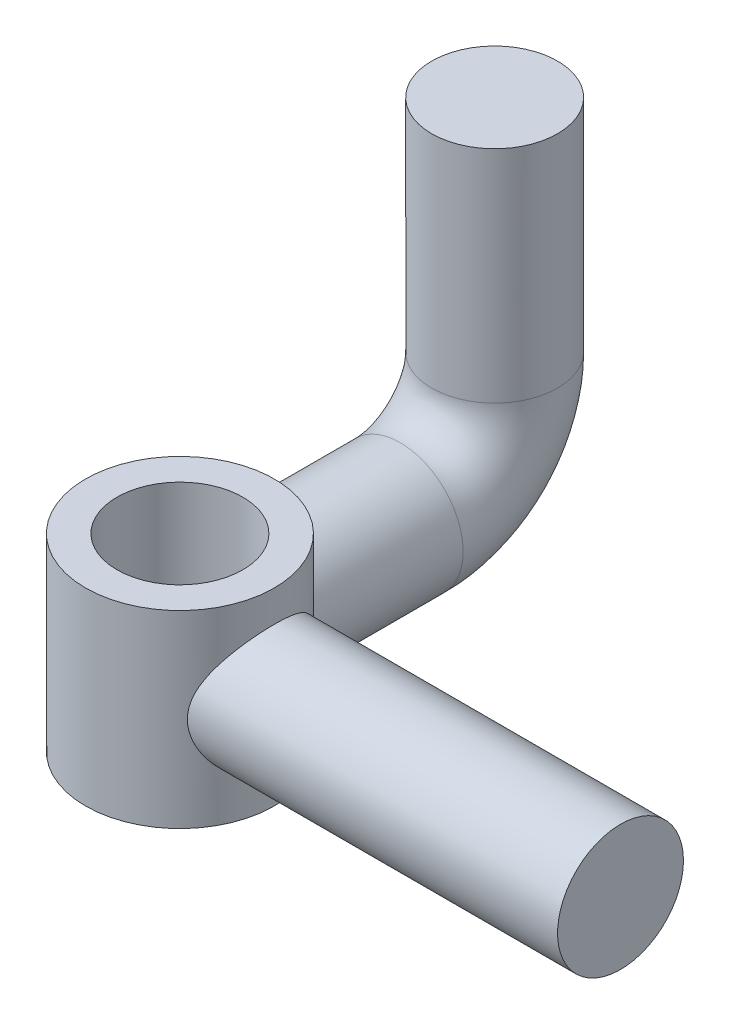
ISO-10303-21;
HEADER;
FILE_DESCRIPTION(('STEP AP214'),'2;1');
FILE_NAME('part.step','',(''),(''),'','','');
FILE_SCHEMA(('AUTOMOTIVE_DESIGN { 1 0 10303 214 1 1 1 1 }'));
ENDSEC;
DATA;
#1=APPLICATION_CONTEXT('core data for automotive mechanical design processes');
#2=APPLICATION_PROTOCOL_DEFINITION('international standard','automotive_design',2000,#1);
#3=PRODUCT_CONTEXT('',#1,'mechanical');
#4=PRODUCT('Part','Part','',(#3));
#5=PRODUCT_RELATED_PRODUCT_CATEGORY('part','',(#4));
#6=PRODUCT_DEFINITION_FORMATION('','',#4);
#7=PRODUCT_DEFINITION_CONTEXT('part definition',#1,'design');
#8=PRODUCT_DEFINITION('design','',#6,#7);
#9=PRODUCT_DEFINITION_SHAPE('','',#8);
#10=(LENGTH_UNIT() NAMED_UNIT(*) SI_UNIT(.MILLI.,.METRE.));
#11=(NAMED_UNIT(*) PLANE_ANGLE_UNIT() SI_UNIT($,.RADIAN.));
#12=(NAMED_UNIT(*) SI_UNIT($,.STERADIAN.) SOLID_ANGLE_UNIT());
#13=UNCERTAINTY_MEASURE_WITH_UNIT(LENGTH_MEASURE(1.E-05),#10,'distance_accuracy_value','');
#14=(GEOMETRIC_REPRESENTATION_CONTEXT(3) GLOBAL_UNCERTAINTY_ASSIGNED_CONTEXT((#13)) GLOBAL_UNIT_ASSIGNED_CONTEXT((#10,
#11,#12)) REPRESENTATION_CONTEXT('',''));
#15=CARTESIAN_POINT('',(0.,0.,0.));
#16=DIRECTION('',(0.,0.,1.));
#17=DIRECTION('',(1.,0.,0.));
#18=AXIS2_PLACEMENT_3D('',#15,#16,#17);
#19=CARTESIAN_POINT('',(0.,-3.,0.));
#20=DIRECTION('',(0.,1.,0.));
#21=DIRECTION('',(0.,0.,1.));
#22=AXIS2_PLACEMENT_3D('',#19,#20,#21);
#23=CYLINDRICAL_SURFACE('',#22,1.5);
#24=CARTESIAN_POINT('',(1.1180339887499,-1.5,-1.));
#25=CARTESIAN_POINT('',(1.11803876731408,-1.45118584456569,-0.999997269988655));
#26=CARTESIAN_POINT('',(1.12129035523721,-1.4023546231456,-0.99639496251832));
#27=CARTESIAN_POINT('',(1.13365986250808,-1.30644004417459,-0.982291341588655));
#28=CARTESIAN_POINT('',(1.14278830406355,-1.25935998223522,-0.971777652939311));
#29=CARTESIAN_POINT('',(1.16528292912785,-1.16863227906116,-0.94467930838316));
#30=CARTESIAN_POINT('',(1.17860780897301,-1.12495615163117,-0.928153590071069));
#31=CARTESIAN_POINT('',(1.20792047340913,-1.04106708382667,-0.889670041967692));
#32=CARTESIAN_POINT('',(1.22390881079415,-1.00085486501176,-0.867711084060814));
#33=CARTESIAN_POINT('',(1.25973036466013,-0.918176556191546,-0.815012050038568));
#34=CARTESIAN_POINT('',(1.27977468045182,-0.876333941141401,-0.783437177258661));
#35=CARTESIAN_POINT('',(1.31972413654041,-0.797998645562859,-0.714096098703399));
#36=CARTESIAN_POINT('',(1.33962912148992,-0.761511239170736,-0.6763238658854));
#37=CARTESIAN_POINT('',(1.38044409261874,-0.689678170609168,-0.589078452471477));
#38=CARTESIAN_POINT('',(1.40108392923461,-0.655258744112164,-0.538703219829094));
#39=CARTESIAN_POINT('',(1.43779242241382,-0.595678952254963,-0.431235482106116));
#40=CARTESIAN_POINT('',(1.45386618115518,-0.570508242984405,-0.374150576160852));
#41=CARTESIAN_POINT('',(1.47799953732363,-0.533221799491274,-0.261624536740001));
#42=CARTESIAN_POINT('',(1.48675587807934,-0.519958327752221,-0.206717362590708));
#43=CARTESIAN_POINT('',(1.49804872730961,-0.502907755358176,-0.0948477243649308));
#44=CARTESIAN_POINT('',(1.5005930688118,-0.499108720387279,-0.0378879406429122));
#45=CARTESIAN_POINT('',(1.49927680861477,-0.501086224974526,0.0670735251161651));
#46=CARTESIAN_POINT('',(1.49633132455064,-0.505494525658531,0.115120319004377));
#47=CARTESIAN_POINT('',(1.4860409139501,-0.521045525679454,0.209619316635508));
#48=CARTESIAN_POINT('',(1.47869566656551,-0.532188716151771,0.256071403824862));
#49=CARTESIAN_POINT('',(1.46026045851868,-0.560597842397288,0.346038968835585));
#50=CARTESIAN_POINT('',(1.44918538991339,-0.577839442599278,0.389565311922981));
#51=CARTESIAN_POINT('',(1.42410552238144,-0.61777682147641,0.473104575326778));
#52=CARTESIAN_POINT('',(1.41010018872581,-0.640473595750756,0.513116852484701));
#53=CARTESIAN_POINT('',(1.37809029225351,-0.693989368729946,0.59414214598172));
#54=CARTESIAN_POINT('',(1.35980204396013,-0.725483761676395,0.634595740498539));
#55=CARTESIAN_POINT('',(1.32200300913499,-0.793949339740162,0.709994037491523));
#56=CARTESIAN_POINT('',(1.30249036407615,-0.830928972966907,0.744930067597285));
#57=CARTESIAN_POINT('',(1.26075022472076,-0.915981605106644,0.813861176630826));
#58=CARTESIAN_POINT('',(1.23857160004468,-0.96488553985724,0.846867965631777));
#59=CARTESIAN_POINT('',(1.19737805415546,-1.06875491961036,0.904174374727408));
#60=CARTESIAN_POINT('',(1.17835785767438,-1.12370999720697,0.92848859327447));
#61=CARTESIAN_POINT('',(1.15131435153449,-1.22235953103654,0.961663622838891));
#62=CARTESIAN_POINT('',(1.1417018228885,-1.2647966850284,0.972953958737704));
#63=CARTESIAN_POINT('',(1.1270451989479,-1.35151974490846,0.989897777900029));
#64=CARTESIAN_POINT('',(1.12199318391119,-1.39580230558646,0.995561034821825));
#65=CARTESIAN_POINT('',(1.11723778493745,-1.48522149322059,1.00089700074453));
#66=CARTESIAN_POINT('',(1.11755766933454,-1.53036098925948,1.00054364876605));
#67=CARTESIAN_POINT('',(1.12354940184257,-1.6198419169781,0.993808148581262));
#68=CARTESIAN_POINT('',(1.12922558823607,-1.66418267205586,0.987421113449806));
#69=CARTESIAN_POINT('',(1.14463988751152,-1.74869470877286,0.969499055937226));
#70=CARTESIAN_POINT('',(1.15416593537715,-1.78896385449378,0.958230872657146));
#71=CARTESIAN_POINT('',(1.17614979263984,-1.86706311803266,0.931115208135282));
#72=CARTESIAN_POINT('',(1.18860858636727,-1.9048924115095,0.915266188999618));
#73=CARTESIAN_POINT('',(1.21805741810736,-1.98510100188837,0.875816733031263));
#74=CARTESIAN_POINT('',(1.23545540768822,-2.02687840563095,0.851300144226031));
#75=CARTESIAN_POINT('',(1.27131257456476,-2.10620840116497,0.796763657645589));
#76=CARTESIAN_POINT('',(1.2897730248931,-2.14375575832942,0.766737059459379));
#77=CARTESIAN_POINT('',(1.33037839141598,-2.22198117378524,0.694383288512648));
#78=CARTESIAN_POINT('',(1.35244726064259,-2.26155142413785,0.650801932557862));
#79=CARTESIAN_POINT('',(1.39387790925842,-2.33290834145647,0.556549744344255));
#80=CARTESIAN_POINT('',(1.41324207395941,-2.36470188562506,0.505885238731677));
#81=CARTESIAN_POINT('',(1.44395410620131,-2.41394586946146,0.408743737408332));
#82=CARTESIAN_POINT('',(1.45612729055242,-2.4329782522209,0.363331182442473));
#83=CARTESIAN_POINT('',(1.47639353933783,-2.46430359715951,0.269378539510944));
#84=CARTESIAN_POINT('',(1.48449004936067,-2.47660225142969,0.220841131929569));
#85=CARTESIAN_POINT('',(1.49589182013302,-2.49384848191957,0.121684696151536));
#86=CARTESIAN_POINT('',(1.49917575428247,-2.49876333975339,0.0710574184621094));
#87=CARTESIAN_POINT('',(1.50054910514547,-2.5008239257085,-0.0304277732903167));
#88=CARTESIAN_POINT('',(1.49863900469456,-2.49797037597807,-0.0812856654767114));
#89=CARTESIAN_POINT('',(1.49014777988657,-2.48517025549766,-0.177878766264066));
#90=CARTESIAN_POINT('',(1.48391638604927,-2.4757545075691,-0.223717571535269));
#91=CARTESIAN_POINT('',(1.46768053103468,-2.45088099528455,-0.313009211498529));
#92=CARTESIAN_POINT('',(1.45767548373552,-2.43542229232637,-0.356461674343445));
#93=CARTESIAN_POINT('',(1.43395882743097,-2.39803064755799,-0.442573648304177));
#94=CARTESIAN_POINT('',(1.42006624473169,-2.37577484625246,-0.485041794600133));
#95=CARTESIAN_POINT('',(1.38987704117736,-2.32592467768701,-0.565776331341591));
#96=CARTESIAN_POINT('',(1.37357898322632,-2.298327116024,-0.60404018602501));
#97=CARTESIAN_POINT('',(1.33696465736197,-2.23368554883184,-0.68164711100701));
#98=CARTESIAN_POINT('',(1.31641956938685,-2.19583848816298,-0.720213397630456));
#99=CARTESIAN_POINT('',(1.27526678824743,-2.11444322922708,-0.790800111407978));
#100=CARTESIAN_POINT('',(1.25465905985077,-2.07089080558295,-0.822815641619616));
#101=CARTESIAN_POINT('',(1.21692106795149,-1.98206620462235,-0.877566267592056));
#102=CARTESIAN_POINT('',(1.19964543370952,-1.93717909502483,-0.900823234486051));
#103=CARTESIAN_POINT('',(1.16873750795511,-1.84335777550342,-0.940579011701362));
#104=CARTESIAN_POINT('',(1.15509815647652,-1.79443165306892,-0.957090951406666));
#105=CARTESIAN_POINT('',(1.1359552596477,-1.70461426578772,-0.979681312354539));
#106=CARTESIAN_POINT('',(1.12931847705076,-1.66434588160485,-0.987261141866242));
#107=CARTESIAN_POINT('',(1.12035759608004,-1.58272179974773,-0.997419579094631));
#108=CARTESIAN_POINT('',(1.11802993920738,-1.54136702786971,-1.00000231351858));
#109=CARTESIAN_POINT('',(1.1180339887499,-1.5,-1.));
#110=B_SPLINE_CURVE_WITH_KNOTS('',3,(#24,#25,#26,#27,#28,#29,#30,#31,#32,#33,#34,#35,#36,#37,
#38,#39,#40,#41,#42,#43,#44,#45,#46,#47,#48,#49,#50,#51,#52,#53,#54,#55,#56,#57,#58,#59,#60,#61,
#62,#63,#64,#65,#66,#67,#68,#69,#70,#71,#72,#73,#74,#75,#76,#77,#78,#79,#80,#81,#82,#83,#84,#85,
#86,#87,#88,#89,#90,#91,#92,#93,#94,#95,#96,#97,#98,#99,#100,#101,#102,#103,#104,#105,#106,#107,
#108,#109),.UNSPECIFIED.,.T.,.F.,(4,2,2,2,2,2,2,2,2,2,2,2,2,2,2,2,2,2,2,2,2,2,2,2,2,2,2,2,2,2,2,
2,2,2,2,2,2,2,2,2,2,2,4),(0.,0.146253465361077,0.292769521129644,0.437886325608137,
0.583033286332745,0.750773385343188,0.918677592181377,1.11083515503145,1.3027771469429,
1.4731874103179,1.64338268344149,1.78769767477871,1.93202319141873,2.07577915986595,
2.219561384515,2.38223762973317,2.54516707398319,2.73339351752472,2.92130234871974,
3.05563045200662,3.18972483117743,3.32440018819018,3.45918471785299,3.58738225853468,
3.71562288822479,3.86949615025543,4.0235577839993,4.21127342259657,4.39882245285466,
4.55035290305025,4.70175506443412,4.85382614632258,5.00588309222248,5.1468839112404,
5.28790663945594,5.43708931492125,5.58636147964719,5.75911103141433,5.93198925208477,
6.09167062897535,6.25103968323788,6.37508308151303,6.49902399831892),.UNSPECIFIED.);
#111=CARTESIAN_POINT('',(1.1180339887499,-1.5,-1.));
#112=VERTEX_POINT('',#111);
#113=EDGE_CURVE('E10',#112,#112,#110,.T.);
#114=ORIENTED_EDGE('',*,*,#113,.F.);
#115=EDGE_LOOP('',(#114));
#116=FACE_BOUND('',#115,.T.);
#117=CARTESIAN_POINT('',(0.,-3.,0.));
#118=DIRECTION('',(0.,1.,0.));
#119=DIRECTION('',(0.,0.,1.));
#120=AXIS2_PLACEMENT_3D('',#117,#118,#119);
#121=CIRCLE('',#120,1.5);
#122=CARTESIAN_POINT('',(0.,-3.,1.5));
#123=VERTEX_POINT('',#122);
#124=EDGE_CURVE('E48',#123,#123,#121,.T.);
#125=ORIENTED_EDGE('',*,*,#124,.T.);
#126=EDGE_LOOP('',(#125));
#127=FACE_BOUND('',#126,.T.);
#128=CARTESIAN_POINT('',(0.,0.,0.));
#129=DIRECTION('',(0.,1.,0.));
#130=DIRECTION('',(0.,0.,1.));
#131=AXIS2_PLACEMENT_3D('',#128,#129,#130);
#132=CIRCLE('',#131,1.5);
#133=CARTESIAN_POINT('',(0.,0.,1.5));
#134=VERTEX_POINT('',#133);
#135=EDGE_CURVE('E52',#134,#134,#132,.T.);
#136=ORIENTED_EDGE('',*,*,#135,.F.);
#137=EDGE_LOOP('',(#136));
#138=FACE_BOUND('',#137,.T.);
#139=CARTESIAN_POINT('',(-1.,-1.5,-1.1180339887499));
#140=CARTESIAN_POINT('',(-0.999997269988655,-1.45118584456569,-1.11803876731408));
#141=CARTESIAN_POINT('',(-0.99639496251832,-1.4023546231456,-1.12129035523721));
#142=CARTESIAN_POINT('',(-0.982291341588655,-1.30644004417459,-1.13365986250808));
#143=CARTESIAN_POINT('',(-0.971777652939312,-1.25935998223522,-1.14278830406355));
#144=CARTESIAN_POINT('',(-0.94467930838316,-1.16863227906116,-1.16528292912785));
#145=CARTESIAN_POINT('',(-0.92815359007107,-1.12495615163117,-1.17860780897301));
#146=CARTESIAN_POINT('',(-0.889670041967692,-1.04106708382667,-1.20792047340913));
#147=CARTESIAN_POINT('',(-0.867711084060814,-1.00085486501176,-1.22390881079415));
#148=CARTESIAN_POINT('',(-0.815012050038569,-0.918176556191547,-1.25973036466013));
#149=CARTESIAN_POINT('',(-0.783437177258661,-0.876333941141401,-1.27977468045182));
#150=CARTESIAN_POINT('',(-0.7140960987034,-0.797998645562859,-1.31972413654041));
#151=CARTESIAN_POINT('',(-0.676323865885401,-0.761511239170737,-1.33962912148992));
#152=CARTESIAN_POINT('',(-0.589078452471478,-0.689678170609168,-1.38044409261874));
#153=CARTESIAN_POINT('',(-0.538703219829095,-0.655258744112164,-1.40108392923461));
#154=CARTESIAN_POINT('',(-0.431235482106116,-0.595678952254963,-1.43779242241382));
#155=CARTESIAN_POINT('',(-0.374150576160852,-0.570508242984405,-1.45386618115518));
#156=CARTESIAN_POINT('',(-0.261624536740002,-0.533221799491273,-1.47799953732363));
#157=CARTESIAN_POINT('',(-0.206717362590708,-0.519958327752221,-1.48675587807934));
#158=CARTESIAN_POINT('',(-0.0948477243649309,-0.502907755358176,-1.49804872730961));
#159=CARTESIAN_POINT('',(-0.0378879406429125,-0.499108720387279,-1.5005930688118));
#160=CARTESIAN_POINT('',(0.0670735251161647,-0.501086224974525,-1.49927680861477));
#161=CARTESIAN_POINT('',(0.115120319004376,-0.505494525658531,-1.49633132455064));
#162=CARTESIAN_POINT('',(0.209619316635508,-0.521045525679453,-1.4860409139501));
#163=CARTESIAN_POINT('',(0.256071403824862,-0.532188716151771,-1.47869566656551));
#164=CARTESIAN_POINT('',(0.346038968835585,-0.560597842397288,-1.46026045851868));
#165=CARTESIAN_POINT('',(0.389565311922981,-0.577839442599278,-1.44918538991339));
#166=CARTESIAN_POINT('',(0.473104575326778,-0.617776821476409,-1.42410552238144));
#167=CARTESIAN_POINT('',(0.513116852484701,-0.640473595750756,-1.41010018872581));
#168=CARTESIAN_POINT('',(0.59414214598172,-0.693989368729946,-1.37809029225351));
#169=CARTESIAN_POINT('',(0.634595740498539,-0.725483761676394,-1.35980204396012));
#170=CARTESIAN_POINT('',(0.709994037491523,-0.793949339740162,-1.32200300913499));
#171=CARTESIAN_POINT('',(0.744930067597285,-0.830928972966907,-1.30249036407615));
#172=CARTESIAN_POINT('',(0.813861176630826,-0.915981605106644,-1.26075022472076));
#173=CARTESIAN_POINT('',(0.846867965631777,-0.96488553985724,-1.23857160004468));
#174=CARTESIAN_POINT('',(0.904174374727408,-1.06875491961036,-1.19737805415546));
#175=CARTESIAN_POINT('',(0.928488593274471,-1.12370999720697,-1.17835785767438));
#176=CARTESIAN_POINT('',(0.961663622838891,-1.22235953103654,-1.15131435153449));
#177=CARTESIAN_POINT('',(0.972953958737705,-1.2647966850284,-1.1417018228885));
#178=CARTESIAN_POINT('',(0.98989777790003,-1.35151974490846,-1.1270451989479));
#179=CARTESIAN_POINT('',(0.995561034821826,-1.39580230558646,-1.12199318391119));
#180=CARTESIAN_POINT('',(1.00089700074453,-1.48522149322059,-1.11723778493745));
#181=CARTESIAN_POINT('',(1.00054364876605,-1.53036098925948,-1.11755766933454));
#182=CARTESIAN_POINT('',(0.993808148581262,-1.6198419169781,-1.12354940184257));
#183=CARTESIAN_POINT('',(0.987421113449806,-1.66418267205586,-1.12922558823607));
#184=CARTESIAN_POINT('',(0.969499055937226,-1.74869470877286,-1.14463988751152));
#185=CARTESIAN_POINT('',(0.958230872657146,-1.78896385449378,-1.15416593537715));
#186=CARTESIAN_POINT('',(0.931115208135282,-1.86706311803266,-1.17614979263984));
#187=CARTESIAN_POINT('',(0.915266188999619,-1.9048924115095,-1.18860858636727));
#188=CARTESIAN_POINT('',(0.875816733031263,-1.98510100188837,-1.21805741810736));
#189=CARTESIAN_POINT('',(0.851300144226031,-2.02687840563095,-1.23545540768822));
#190=CARTESIAN_POINT('',(0.79676365764559,-2.10620840116497,-1.27131257456476));
#191=CARTESIAN_POINT('',(0.766737059459379,-2.14375575832942,-1.2897730248931));
#192=CARTESIAN_POINT('',(0.694383288512649,-2.22198117378524,-1.33037839141598));
#193=CARTESIAN_POINT('',(0.650801932557863,-2.26155142413785,-1.35244726064259));
#194=CARTESIAN_POINT('',(0.556549744344256,-2.33290834145647,-1.39387790925842));
#195=CARTESIAN_POINT('',(0.505885238731678,-2.36470188562506,-1.41324207395941));
#196=CARTESIAN_POINT('',(0.408743737408333,-2.41394586946146,-1.44395410620131));
#197=CARTESIAN_POINT('',(0.363331182442473,-2.4329782522209,-1.45612729055242));
#198=CARTESIAN_POINT('',(0.269378539510944,-2.46430359715951,-1.47639353933783));
#199=CARTESIAN_POINT('',(0.220841131929569,-2.47660225142969,-1.48449004936067));
#200=CARTESIAN_POINT('',(0.121684696151536,-2.49384848191957,-1.49589182013302));
#201=CARTESIAN_POINT('',(0.0710574184621097,-2.49876333975339,-1.49917575428247));
#202=CARTESIAN_POINT('',(-0.0304277732903164,-2.5008239257085,-1.50054910514547));
#203=CARTESIAN_POINT('',(-0.0812856654767112,-2.49797037597807,-1.49863900469456));
#204=CARTESIAN_POINT('',(-0.177878766264065,-2.48517025549766,-1.49014777988657));
#205=CARTESIAN_POINT('',(-0.223717571535269,-2.4757545075691,-1.48391638604927));
#206=CARTESIAN_POINT('',(-0.313009211498529,-2.45088099528455,-1.46768053103468));
#207=CARTESIAN_POINT('',(-0.356461674343445,-2.43542229232637,-1.45767548373552));
#208=CARTESIAN_POINT('',(-0.442573648304177,-2.39803064755799,-1.43395882743097));
#209=CARTESIAN_POINT('',(-0.485041794600133,-2.37577484625246,-1.42006624473169));
#210=CARTESIAN_POINT('',(-0.565776331341591,-2.32592467768701,-1.38987704117736));
#211=CARTESIAN_POINT('',(-0.60404018602501,-2.298327116024,-1.37357898322632));
#212=CARTESIAN_POINT('',(-0.68164711100701,-2.23368554883184,-1.33696465736197));
#213=CARTESIAN_POINT('',(-0.720213397630456,-2.19583848816298,-1.31641956938685));
#214=CARTESIAN_POINT('',(-0.790800111407978,-2.11444322922708,-1.27526678824743));
#215=CARTESIAN_POINT('',(-0.822815641619616,-2.07089080558295,-1.25465905985077));
#216=CARTESIAN_POINT('',(-0.877566267592056,-1.98206620462235,-1.21692106795149));
#217=CARTESIAN_POINT('',(-0.900823234486051,-1.93717909502483,-1.19964543370952));
#218=CARTESIAN_POINT('',(-0.940579011701362,-1.84335777550342,-1.16873750795511));
#219=CARTESIAN_POINT('',(-0.957090951406666,-1.79443165306892,-1.15509815647652));
#220=CARTESIAN_POINT('',(-0.97968131235454,-1.70461426578772,-1.1359552596477));
#221=CARTESIAN_POINT('',(-0.987261141866242,-1.66434588160485,-1.12931847705076));
#222=CARTESIAN_POINT('',(-0.997419579094631,-1.58272179974773,-1.12035759608004));
#223=CARTESIAN_POINT('',(-1.00000231351858,-1.54136702786971,-1.11802993920738));
#224=CARTESIAN_POINT('',(-1.,-1.5,-1.1180339887499));
#225=B_SPLINE_CURVE_WITH_KNOTS('',3,(#139,#140,#141,#142,#143,#144,#145,#146,#147,#148,#149,
#150,#151,#152,#153,#154,#155,#156,#157,#158,#159,#160,#161,#162,#163,#164,#165,#166,#167,#168,
#169,#170,#171,#172,#173,#174,#175,#176,#177,#178,#179,#180,#181,#182,#183,#184,#185,#186,#187,
#188,#189,#190,#191,#192,#193,#194,#195,#196,#197,#198,#199,#200,#201,#202,#203,#204,#205,#206,
#207,#208,#209,#210,#211,#212,#213,#214,#215,#216,#217,#218,#219,#220,#221,#222,#223,#224),
.UNSPECIFIED.,.T.,.F.,(4,2,2,2,2,2,2,2,2,2,2,2,2,2,2,2,2,2,2,2,2,2,2,2,2,2,2,2,2,2,2,2,2,2,2,2,
2,2,2,2,2,2,4),(0.,0.146253465361076,0.292769521129644,0.437886325608137,0.583033286332745,
0.750773385343188,0.918677592181376,1.11083515503145,1.3027771469429,1.4731874103179,
1.64338268344149,1.78769767477871,1.93202319141873,2.07577915986595,2.219561384515,
2.38223762973317,2.54516707398319,2.73339351752472,2.92130234871974,3.05563045200662,
3.18972483117743,3.32440018819018,3.45918471785299,3.58738225853468,3.71562288822479,
3.86949615025543,4.0235577839993,4.21127342259657,4.39882245285466,4.55035290305025,
4.70175506443412,4.85382614632258,5.00588309222248,5.1468839112404,5.28790663945594,
5.43708931492125,5.58636147964719,5.75911103141433,5.93198925208478,6.09167062897535,
6.25103968323789,6.37508308151303,6.49902399831892),.UNSPECIFIED.);
#226=CARTESIAN_POINT('',(-1.,-1.5,-1.1180339887499));
#227=VERTEX_POINT('',#226);
#228=EDGE_CURVE('E62',#227,#227,#225,.T.);
#229=ORIENTED_EDGE('',*,*,#228,.F.);
#230=EDGE_LOOP('',(#229));
#231=FACE_BOUND('',#230,.T.);
#232=ADVANCED_FACE('F37',(#116,#127,#138,#231),#23,.T.);
#233=CARTESIAN_POINT('',(0.,-3.,0.));
#234=DIRECTION('',(0.,1.,0.));
#235=DIRECTION('',(0.,0.,1.));
#236=AXIS2_PLACEMENT_3D('',#233,#234,#235);
#237=PLANE('',#236);
#238=CARTESIAN_POINT('',(0.,-3.,0.));
#239=DIRECTION('',(0.,1.,0.));
#240=DIRECTION('',(0.,0.,1.));
#241=AXIS2_PLACEMENT_3D('',#238,#239,#240);
#242=CIRCLE('',#241,1.);
#243=CARTESIAN_POINT('',(0.,-3.,1.));
#244=VERTEX_POINT('',#243);
#245=EDGE_CURVE('E57',#244,#244,#242,.T.);
#246=ORIENTED_EDGE('',*,*,#245,.T.);
#247=EDGE_LOOP('',(#246));
#248=FACE_BOUND('',#247,.T.);
#249=ORIENTED_EDGE('',*,*,#124,.F.);
#250=EDGE_LOOP('',(#249));
#251=FACE_BOUND('',#250,.T.);
#252=ADVANCED_FACE('F84',(#248,#251),#237,.F.);
#253=CARTESIAN_POINT('',(0.,0.,0.));
#254=DIRECTION('',(0.,1.,0.));
#255=DIRECTION('',(0.,0.,1.));
#256=AXIS2_PLACEMENT_3D('',#253,#254,#255);
#257=PLANE('',#256);
#258=CARTESIAN_POINT('',(0.,0.,0.));
#259=DIRECTION('',(0.,1.,0.));
#260=DIRECTION('',(0.,0.,1.));
#261=AXIS2_PLACEMENT_3D('',#258,#259,#260);
#262=CIRCLE('',#261,1.);
#263=CARTESIAN_POINT('',(0.,0.,1.));
#264=VERTEX_POINT('',#263);
#265=EDGE_CURVE('E59',#264,#264,#262,.T.);
#266=ORIENTED_EDGE('',*,*,#265,.F.);
#267=EDGE_LOOP('',(#266));
#268=FACE_BOUND('',#267,.T.);
#269=ORIENTED_EDGE('',*,*,#135,.T.);
#270=EDGE_LOOP('',(#269));
#271=FACE_BOUND('',#270,.T.);
#272=ADVANCED_FACE('F82',(#268,#271),#257,.T.);
#273=CARTESIAN_POINT('',(0.,-3.,0.));
#274=DIRECTION('',(0.,1.,0.));
#275=DIRECTION('',(0.,0.,1.));
#276=AXIS2_PLACEMENT_3D('',#273,#274,#275);
#277=CYLINDRICAL_SURFACE('',#276,1.);
#278=ORIENTED_EDGE('',*,*,#245,.F.);
#279=EDGE_LOOP('',(#278));
#280=FACE_BOUND('',#279,.T.);
#281=ORIENTED_EDGE('',*,*,#265,.T.);
#282=EDGE_LOOP('',(#281));
#283=FACE_BOUND('',#282,.T.);
#284=ADVANCED_FACE('F79',(#280,#283),#277,.F.);
#285=CARTESIAN_POINT('',(0.,-1.5,1.501));
#286=DIRECTION('',(0.,0.,-1.));
#287=DIRECTION('',(-1.,0.,0.));
#288=AXIS2_PLACEMENT_3D('',#285,#286,#287);
#289=CYLINDRICAL_SURFACE('',#288,1.);
#290=ORIENTED_EDGE('',*,*,#228,.T.);
#291=EDGE_LOOP('',(#290));
#292=FACE_BOUND('',#291,.T.);
#293=CARTESIAN_POINT('',(0.,-1.5,-3.5));
#294=DIRECTION('',(0.,0.,-1.));
#295=DIRECTION('',(0.,1.,0.));
#296=AXIS2_PLACEMENT_3D('',#293,#294,#295);
#297=CIRCLE('',#296,1.);
#298=CARTESIAN_POINT('',(0.,-2.5,-3.5));
#299=VERTEX_POINT('',#298);
#300=EDGE_CURVE('E108',#299,#299,#297,.T.);
#301=ORIENTED_EDGE('',*,*,#300,.F.);
#302=EDGE_LOOP('',(#301));
#303=FACE_BOUND('',#302,.T.);
#304=ADVANCED_FACE('F74',(#292,#303),#289,.T.);
#305=CARTESIAN_POINT('',(0.,3.5,-5.));
#306=DIRECTION('',(0.,1.,0.));
#307=DIRECTION('',(0.,0.,1.));
#308=AXIS2_PLACEMENT_3D('',#305,#306,#307);
#309=PLANE('',#308);
#310=CARTESIAN_POINT('',(0.,3.5,-5.));
#311=DIRECTION('',(0.,1.,0.));
#312=DIRECTION('',(0.,0.,1.));
#313=AXIS2_PLACEMENT_3D('',#310,#311,#312);
#314=CIRCLE('',#313,1.);
#315=CARTESIAN_POINT('',(0.,3.5,-4.));
#316=VERTEX_POINT('',#315);
#317=EDGE_CURVE('E72',#316,#316,#314,.T.);
#318=ORIENTED_EDGE('',*,*,#317,.T.);
#319=EDGE_LOOP('',(#318));
#320=FACE_BOUND('',#319,.T.);
#321=ADVANCED_FACE('F104',(#320),#309,.T.);
#322=CARTESIAN_POINT('',(0.,0.,-3.5));
#323=DIRECTION('',(1.,0.,0.));
#324=DIRECTION('',(0.,0.,-1.));
#325=AXIS2_PLACEMENT_3D('',#322,#323,#324);
#326=TOROIDAL_SURFACE('',#325,1.5,1.);
#327=CARTESIAN_POINT('',(0.,0.,-5.));
#328=DIRECTION('',(0.,1.,0.));
#329=DIRECTION('',(0.,0.,1.));
#330=AXIS2_PLACEMENT_3D('',#327,#328,#329);
#331=CIRCLE('',#330,1.);
#332=CARTESIAN_POINT('',(0.,0.,-6.));
#333=VERTEX_POINT('',#332);
#334=EDGE_CURVE('E110',#333,#333,#331,.T.);
#335=CARTESIAN_POINT('',(0.,0.,-3.5));
#336=DIRECTION('',(1.,0.,0.));
#337=DIRECTION('',(0.,0.,-1.));
#338=AXIS2_PLACEMENT_3D('',#335,#336,#337);
#339=CIRCLE('',#338,2.5);
#340=EDGE_CURVE('',#299,#333,#339,.T.);
#341=ORIENTED_EDGE('',*,*,#300,.T.);
#342=ORIENTED_EDGE('',*,*,#334,.F.);
#343=ORIENTED_EDGE('',*,*,#340,.T.);
#344=ORIENTED_EDGE('',*,*,#340,.F.);
#345=EDGE_LOOP('',(#341,#343,#342,#344));
#346=FACE_BOUND('',#345,.T.);
#347=ADVANCED_FACE('F128',(#346),#326,.T.);
#348=CARTESIAN_POINT('',(0.,0.,-5.));
#349=DIRECTION('',(0.,1.,0.));
#350=DIRECTION('',(0.,0.,1.));
#351=AXIS2_PLACEMENT_3D('',#348,#349,#350);
#352=CYLINDRICAL_SURFACE('',#351,1.);
#353=ORIENTED_EDGE('',*,*,#317,.F.);
#354=EDGE_LOOP('',(#353));
#355=FACE_BOUND('',#354,.T.);
#356=ORIENTED_EDGE('',*,*,#334,.T.);
#357=EDGE_LOOP('',(#356));
#358=FACE_BOUND('',#357,.T.);
#359=ADVANCED_FACE('F105',(#355,#358),#352,.T.);
#360=CARTESIAN_POINT('',(7.,-1.5,0.));
#361=DIRECTION('',(1.,0.,0.));
#362=DIRECTION('',(0.,0.,-1.));
#363=AXIS2_PLACEMENT_3D('',#360,#361,#362);
#364=PLANE('',#363);
#365=CARTESIAN_POINT('',(7.,-1.5,0.));
#366=DIRECTION('',(1.,0.,0.));
#367=DIRECTION('',(0.,0.,-1.));
#368=AXIS2_PLACEMENT_3D('',#365,#366,#367);
#369=CIRCLE('',#368,1.);
#370=CARTESIAN_POINT('',(7.,-1.5,-1.));
#371=VERTEX_POINT('',#370);
#372=EDGE_CURVE('E111',#371,#371,#369,.T.);
#373=ORIENTED_EDGE('',*,*,#372,.T.);
#374=EDGE_LOOP('',(#373));
#375=FACE_BOUND('',#374,.T.);
#376=ADVANCED_FACE('F118',(#375),#364,.T.);
#377=CARTESIAN_POINT('',(-1.501,-1.5,0.));
#378=DIRECTION('',(1.,0.,0.));
#379=DIRECTION('',(0.,0.,-1.));
#380=AXIS2_PLACEMENT_3D('',#377,#378,#379);
#381=CYLINDRICAL_SURFACE('',#380,1.);
#382=ORIENTED_EDGE('',*,*,#113,.T.);
#383=EDGE_LOOP('',(#382));
#384=FACE_BOUND('',#383,.T.);
#385=ORIENTED_EDGE('',*,*,#372,.F.);
#386=EDGE_LOOP('',(#385));
#387=FACE_BOUND('',#386,.T.);
#388=ADVANCED_FACE('F120',(#384,#387),#381,.T.);
#389=CLOSED_SHELL('',(#232,#252,#272,#284,#304,#321,#347,#359,#376,#388));
#390=MANIFOLD_SOLID_BREP('B2',#389);
#391=ADVANCED_BREP_SHAPE_REPRESENTATION('',(#18,#390),#14);
#392=SHAPE_DEFINITION_REPRESENTATION(#9,#391);
ENDSEC;
END-ISO-10303-21;
